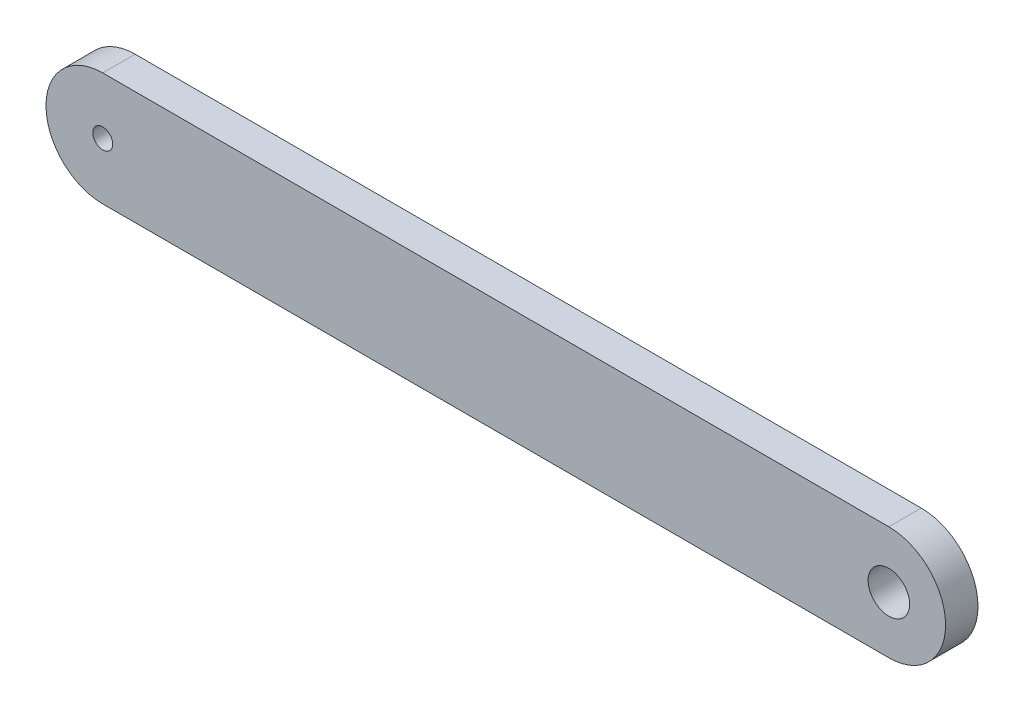
ISO-10303-21;
HEADER;
FILE_DESCRIPTION(('STEP AP214'),'2;1');
FILE_NAME('part.step','',(''),(''),'','','');
FILE_SCHEMA(('AUTOMOTIVE_DESIGN { 1 0 10303 214 1 1 1 1 }'));
ENDSEC;
DATA;
#1=APPLICATION_CONTEXT('core data for automotive mechanical design processes');
#2=APPLICATION_PROTOCOL_DEFINITION('international standard','automotive_design',2000,#1);
#3=PRODUCT_CONTEXT('',#1,'mechanical');
#4=PRODUCT('Part','Part','',(#3));
#5=PRODUCT_RELATED_PRODUCT_CATEGORY('part','',(#4));
#6=PRODUCT_DEFINITION_FORMATION('','',#4);
#7=PRODUCT_DEFINITION_CONTEXT('part definition',#1,'design');
#8=PRODUCT_DEFINITION('design','',#6,#7);
#9=PRODUCT_DEFINITION_SHAPE('','',#8);
#10=(LENGTH_UNIT() NAMED_UNIT(*) SI_UNIT(.MILLI.,.METRE.));
#11=(NAMED_UNIT(*) PLANE_ANGLE_UNIT() SI_UNIT($,.RADIAN.));
#12=(NAMED_UNIT(*) SI_UNIT($,.STERADIAN.) SOLID_ANGLE_UNIT());
#13=UNCERTAINTY_MEASURE_WITH_UNIT(LENGTH_MEASURE(1.E-05),#10,'distance_accuracy_value','');
#14=(GEOMETRIC_REPRESENTATION_CONTEXT(3) GLOBAL_UNCERTAINTY_ASSIGNED_CONTEXT((#13)) GLOBAL_UNIT_ASSIGNED_CONTEXT((#10,
#11,#12)) REPRESENTATION_CONTEXT('',''));
#15=CARTESIAN_POINT('',(0.,0.,0.));
#16=DIRECTION('',(0.,0.,1.));
#17=DIRECTION('',(1.,0.,0.));
#18=AXIS2_PLACEMENT_3D('',#15,#16,#17);
#19=CARTESIAN_POINT('',(0.,0.,5.08));
#20=DIRECTION('',(0.,0.,-1.));
#21=DIRECTION('',(-1.,0.,0.));
#22=AXIS2_PLACEMENT_3D('',#19,#20,#21);
#23=CYLINDRICAL_SURFACE('',#22,8.89);
#24=CARTESIAN_POINT('',(0.,0.,0.));
#25=DIRECTION('',(0.,0.,1.));
#26=DIRECTION('',(1.,0.,0.));
#27=AXIS2_PLACEMENT_3D('',#24,#25,#26);
#28=CIRCLE('',#27,8.89);
#29=CARTESIAN_POINT('',(0.,8.89,0.));
#30=VERTEX_POINT('',#29);
#31=CARTESIAN_POINT('',(-8.0394758274783,3.79459199643284,0.));
#32=VERTEX_POINT('',#31);
#33=EDGE_CURVE('E266',#30,#32,#28,.T.);
#34=ORIENTED_EDGE('',*,*,#33,.T.);
#35=DIRECTION('',(0.,0.,-1.));
#36=VECTOR('',#35,1.);
#37=CARTESIAN_POINT('',(-8.03947582747829,3.79459199643284,5.08));
#38=LINE('',#37,#36);
#39=CARTESIAN_POINT('',(-8.03947582747829,3.79459199643284,2.54));
#40=VERTEX_POINT('',#39);
#41=EDGE_CURVE('E255',#32,#40,#38,.F.);
#42=ORIENTED_EDGE('',*,*,#41,.T.);
#43=CARTESIAN_POINT('',(0.,0.,2.54));
#44=DIRECTION('',(0.,0.,1.));
#45=DIRECTION('',(1.,0.,0.));
#46=AXIS2_PLACEMENT_3D('',#43,#44,#45);
#47=CIRCLE('',#46,8.89);
#48=CARTESIAN_POINT('',(-8.0394758274783,-3.79459199643284,2.54));
#49=VERTEX_POINT('',#48);
#50=EDGE_CURVE('E11',#40,#49,#47,.T.);
#51=ORIENTED_EDGE('',*,*,#50,.T.);
#52=DIRECTION('',(0.,0.,-1.));
#53=VECTOR('',#52,1.);
#54=CARTESIAN_POINT('',(-8.0394758274783,-3.79459199643284,5.08));
#55=LINE('',#54,#53);
#56=CARTESIAN_POINT('',(-8.0394758274783,-3.79459199643284,0.));
#57=VERTEX_POINT('',#56);
#58=EDGE_CURVE('E237',#49,#57,#55,.T.);
#59=ORIENTED_EDGE('',*,*,#58,.T.);
#60=CARTESIAN_POINT('',(0.,-8.89,0.));
#61=VERTEX_POINT('',#60);
#62=EDGE_CURVE('E258',#57,#61,#28,.T.);
#63=ORIENTED_EDGE('',*,*,#62,.T.);
#64=DIRECTION('',(0.,0.,-1.));
#65=VECTOR('',#64,1.);
#66=CARTESIAN_POINT('',(0.,-8.89,5.08));
#67=LINE('',#66,#65);
#68=CARTESIAN_POINT('',(0.,-8.89,5.08));
#69=VERTEX_POINT('',#68);
#70=EDGE_CURVE('E280',#69,#61,#67,.T.);
#71=ORIENTED_EDGE('',*,*,#70,.F.);
#72=CARTESIAN_POINT('',(0.,0.,5.08));
#73=DIRECTION('',(0.,0.,1.));
#74=DIRECTION('',(1.,0.,0.));
#75=AXIS2_PLACEMENT_3D('',#72,#73,#74);
#76=CIRCLE('',#75,8.89);
#77=CARTESIAN_POINT('',(0.,8.89,5.08));
#78=VERTEX_POINT('',#77);
#79=EDGE_CURVE('E259',#78,#69,#76,.T.);
#80=ORIENTED_EDGE('',*,*,#79,.F.);
#81=DIRECTION('',(0.,0.,-1.));
#82=VECTOR('',#81,1.);
#83=CARTESIAN_POINT('',(0.,8.89,5.08));
#84=LINE('',#83,#82);
#85=EDGE_CURVE('E265',#78,#30,#84,.T.);
#86=ORIENTED_EDGE('',*,*,#85,.T.);
#87=EDGE_LOOP('',(#34,#42,#51,#59,#63,#71,#80,#86));
#88=FACE_BOUND('',#87,.T.);
#89=ADVANCED_FACE('F37',(#88),#23,.T.);
#90=CARTESIAN_POINT('',(123.19,-8.89000000000003,5.08));
#91=DIRECTION('',(0.,1.,0.));
#92=DIRECTION('',(-1.,0.,0.));
#93=AXIS2_PLACEMENT_3D('',#90,#91,#92);
#94=PLANE('',#93);
#95=DIRECTION('',(1.,0.,0.));
#96=VECTOR('',#95,1.);
#97=CARTESIAN_POINT('',(123.19,-8.89000000000003,0.));
#98=LINE('',#97,#96);
#99=CARTESIAN_POINT('',(123.19,-8.89000000000003,0.));
#100=VERTEX_POINT('',#99);
#101=EDGE_CURVE('E269',#61,#100,#98,.T.);
#102=ORIENTED_EDGE('',*,*,#101,.T.);
#103=DIRECTION('',(0.,0.,-1.));
#104=VECTOR('',#103,1.);
#105=CARTESIAN_POINT('',(123.19,-8.89000000000003,5.08));
#106=LINE('',#105,#104);
#107=CARTESIAN_POINT('',(123.19,-8.89000000000003,5.08));
#108=VERTEX_POINT('',#107);
#109=EDGE_CURVE('E277',#108,#100,#106,.T.);
#110=ORIENTED_EDGE('',*,*,#109,.F.);
#111=DIRECTION('',(1.,0.,0.));
#112=VECTOR('',#111,1.);
#113=CARTESIAN_POINT('',(123.19,-8.89000000000003,5.08));
#114=LINE('',#113,#112);
#115=EDGE_CURVE('E90',#69,#108,#114,.T.);
#116=ORIENTED_EDGE('',*,*,#115,.F.);
#117=ORIENTED_EDGE('',*,*,#70,.T.);
#118=EDGE_LOOP('',(#102,#110,#116,#117));
#119=FACE_BOUND('',#118,.T.);
#120=ADVANCED_FACE('F298',(#119),#94,.F.);
#121=CARTESIAN_POINT('',(123.19,0.,5.08));
#122=DIRECTION('',(0.,0.,-1.));
#123=DIRECTION('',(-1.,0.,0.));
#124=AXIS2_PLACEMENT_3D('',#121,#122,#123);
#125=CYLINDRICAL_SURFACE('',#124,8.89000000000003);
#126=CARTESIAN_POINT('',(123.19,0.,0.));
#127=DIRECTION('',(0.,0.,1.));
#128=DIRECTION('',(-1.,0.,0.));
#129=AXIS2_PLACEMENT_3D('',#126,#127,#128);
#130=CIRCLE('',#129,8.89000000000003);
#131=CARTESIAN_POINT('',(123.19,8.89000000000003,0.));
#132=VERTEX_POINT('',#131);
#133=EDGE_CURVE('E271',#100,#132,#130,.T.);
#134=ORIENTED_EDGE('',*,*,#133,.T.);
#135=DIRECTION('',(0.,0.,-1.));
#136=VECTOR('',#135,1.);
#137=CARTESIAN_POINT('',(123.19,8.89000000000003,5.08));
#138=LINE('',#137,#136);
#139=CARTESIAN_POINT('',(123.19,8.89000000000003,5.08));
#140=VERTEX_POINT('',#139);
#141=EDGE_CURVE('E275',#140,#132,#138,.T.);
#142=ORIENTED_EDGE('',*,*,#141,.F.);
#143=CARTESIAN_POINT('',(123.19,0.,5.08));
#144=DIRECTION('',(0.,0.,1.));
#145=DIRECTION('',(-1.,0.,0.));
#146=AXIS2_PLACEMENT_3D('',#143,#144,#145);
#147=CIRCLE('',#146,8.89000000000003);
#148=EDGE_CURVE('E262',#108,#140,#147,.T.);
#149=ORIENTED_EDGE('',*,*,#148,.F.);
#150=ORIENTED_EDGE('',*,*,#109,.T.);
#151=EDGE_LOOP('',(#134,#142,#149,#150));
#152=FACE_BOUND('',#151,.T.);
#153=ADVANCED_FACE('F297',(#152),#125,.T.);
#154=CARTESIAN_POINT('',(0.,8.89,5.08));
#155=DIRECTION('',(0.,-1.,0.));
#156=DIRECTION('',(1.,0.,0.));
#157=AXIS2_PLACEMENT_3D('',#154,#155,#156);
#158=PLANE('',#157);
#159=DIRECTION('',(-1.,0.,0.));
#160=VECTOR('',#159,1.);
#161=CARTESIAN_POINT('',(0.,8.89,0.));
#162=LINE('',#161,#160);
#163=EDGE_CURVE('E82',#132,#30,#162,.T.);
#164=ORIENTED_EDGE('',*,*,#163,.T.);
#165=ORIENTED_EDGE('',*,*,#85,.F.);
#166=DIRECTION('',(-1.,0.,0.));
#167=VECTOR('',#166,1.);
#168=CARTESIAN_POINT('',(0.,8.89,5.08));
#169=LINE('',#168,#167);
#170=EDGE_CURVE('E61',#140,#78,#169,.T.);
#171=ORIENTED_EDGE('',*,*,#170,.F.);
#172=ORIENTED_EDGE('',*,*,#141,.T.);
#173=EDGE_LOOP('',(#164,#165,#171,#172));
#174=FACE_BOUND('',#173,.T.);
#175=ADVANCED_FACE('F290',(#174),#158,.F.);
#176=CARTESIAN_POINT('',(0.,0.,5.08));
#177=DIRECTION('',(0.,0.,1.));
#178=DIRECTION('',(1.,0.,0.));
#179=AXIS2_PLACEMENT_3D('',#176,#177,#178);
#180=PLANE('',#179);
#181=CARTESIAN_POINT('',(123.19,0.,5.08));
#182=DIRECTION('',(0.,0.,-1.));
#183=DIRECTION('',(-1.,0.,0.));
#184=AXIS2_PLACEMENT_3D('',#181,#182,#183);
#185=CIRCLE('',#184,3.25120000000001);
#186=CARTESIAN_POINT('',(119.9388,0.,5.08));
#187=VERTEX_POINT('',#186);
#188=EDGE_CURVE('E540',#187,#187,#185,.T.);
#189=ORIENTED_EDGE('',*,*,#188,.T.);
#190=EDGE_LOOP('',(#189));
#191=FACE_BOUND('',#190,.T.);
#192=CARTESIAN_POINT('',(0.,0.,5.08));
#193=DIRECTION('',(0.,0.,1.));
#194=DIRECTION('',(1.,0.,0.));
#195=AXIS2_PLACEMENT_3D('',#192,#193,#194);
#196=CIRCLE('',#195,1.5621);
#197=CARTESIAN_POINT('',(1.5621,0.,5.08));
#198=VERTEX_POINT('',#197);
#199=EDGE_CURVE('E186',#198,#198,#196,.T.);
#200=ORIENTED_EDGE('',*,*,#199,.F.);
#201=EDGE_LOOP('',(#200));
#202=FACE_BOUND('',#201,.T.);
#203=ORIENTED_EDGE('',*,*,#79,.T.);
#204=ORIENTED_EDGE('',*,*,#115,.T.);
#205=ORIENTED_EDGE('',*,*,#148,.T.);
#206=ORIENTED_EDGE('',*,*,#170,.T.);
#207=EDGE_LOOP('',(#203,#204,#205,#206));
#208=FACE_BOUND('',#207,.T.);
#209=ADVANCED_FACE('F351',(#191,#202,#208),#180,.T.);
#210=CARTESIAN_POINT('',(0.,0.,0.));
#211=DIRECTION('',(0.,0.,1.));
#212=DIRECTION('',(1.,0.,0.));
#213=AXIS2_PLACEMENT_3D('',#210,#211,#212);
#214=PLANE('',#213);
#215=CARTESIAN_POINT('',(123.19,0.,0.));
#216=DIRECTION('',(0.,0.,-1.));
#217=DIRECTION('',(-1.,0.,0.));
#218=AXIS2_PLACEMENT_3D('',#215,#216,#217);
#219=CIRCLE('',#218,3.25120000000001);
#220=CARTESIAN_POINT('',(119.9388,0.,0.));
#221=VERTEX_POINT('',#220);
#222=EDGE_CURVE('E543',#221,#221,#219,.T.);
#223=ORIENTED_EDGE('',*,*,#222,.F.);
#224=EDGE_LOOP('',(#223));
#225=FACE_BOUND('',#224,.T.);
#226=CARTESIAN_POINT('',(-5.58736496391635,6.35,0.));
#227=DIRECTION('',(0.,0.,1.));
#228=DIRECTION('',(1.,0.,0.));
#229=AXIS2_PLACEMENT_3D('',#226,#227,#228);
#230=CIRCLE('',#229,2.286);
#231=CARTESIAN_POINT('',(-5.34917440532224,4.07644303836552,0.));
#232=VERTEX_POINT('',#231);
#233=CARTESIAN_POINT('',(-4.07726632502004,4.63378378378379,0.));
#234=VERTEX_POINT('',#233);
#235=EDGE_CURVE('E52',#232,#234,#230,.T.);
#236=ORIENTED_EDGE('',*,*,#235,.F.);
#237=DIRECTION('',(-0.994556851108697,-0.104195344966817,0.));
#238=VECTOR('',#237,1.);
#239=CARTESIAN_POINT('',(-0.480508651610108,4.58651172591279,0.));
#240=LINE('',#239,#238);
#241=EDGE_CURVE('E45',#232,#32,#240,.T.);
#242=ORIENTED_EDGE('',*,*,#241,.T.);
#243=ORIENTED_EDGE('',*,*,#33,.F.);
#244=ORIENTED_EDGE('',*,*,#163,.F.);
#245=ORIENTED_EDGE('',*,*,#133,.F.);
#246=ORIENTED_EDGE('',*,*,#101,.F.);
#247=ORIENTED_EDGE('',*,*,#62,.F.);
#248=DIRECTION('',(-0.994556851108697,0.104195344966817,0.));
#249=VECTOR('',#248,1.);
#250=CARTESIAN_POINT('',(-5.34917440532224,-4.07644303836551,0.));
#251=LINE('',#250,#249);
#252=CARTESIAN_POINT('',(-5.34917440532224,-4.07644303836551,0.));
#253=VERTEX_POINT('',#252);
#254=EDGE_CURVE('E181',#253,#57,#251,.T.);
#255=ORIENTED_EDGE('',*,*,#254,.F.);
#256=CARTESIAN_POINT('',(-5.58736496391639,-6.3500000000001,0.));
#257=DIRECTION('',(0.,0.,1.));
#258=DIRECTION('',(1.,0.,0.));
#259=AXIS2_PLACEMENT_3D('',#256,#257,#258);
#260=CIRCLE('',#259,2.2860000000001);
#261=CARTESIAN_POINT('',(-4.07726632502003,-4.63378378378379,0.));
#262=VERTEX_POINT('',#261);
#263=EDGE_CURVE('E183',#262,#253,#260,.T.);
#264=ORIENTED_EDGE('',*,*,#263,.F.);
#265=CARTESIAN_POINT('',(0.,1.35308431126191E-13,0.));
#266=DIRECTION('',(0.,0.,-1.));
#267=DIRECTION('',(-1.,0.,0.));
#268=AXIS2_PLACEMENT_3D('',#265,#266,#267);
#269=CIRCLE('',#268,6.1722000000001);
#270=CARTESIAN_POINT('',(4.07726632502005,-4.63378378378379,0.));
#271=VERTEX_POINT('',#270);
#272=EDGE_CURVE('E230',#271,#262,#269,.T.);
#273=ORIENTED_EDGE('',*,*,#272,.F.);
#274=CARTESIAN_POINT('',(5.58736496391641,-6.35000000000011,0.));
#275=DIRECTION('',(0.,0.,1.));
#276=DIRECTION('',(1.,0.,0.));
#277=AXIS2_PLACEMENT_3D('',#274,#275,#276);
#278=CIRCLE('',#277,2.28600000000011);
#279=CARTESIAN_POINT('',(5.34917440532226,-4.07644303836552,0.));
#280=VERTEX_POINT('',#279);
#281=EDGE_CURVE('E227',#280,#271,#278,.T.);
#282=ORIENTED_EDGE('',*,*,#281,.F.);
#283=DIRECTION('',(-0.994556851108697,-0.104195344966817,0.));
#284=VECTOR('',#283,1.);
#285=CARTESIAN_POINT('',(16.6336571104214,-2.89421744018161,0.));
#286=LINE('',#285,#284);
#287=CARTESIAN_POINT('',(16.6336571104214,-2.89421744018158,0.));
#288=VERTEX_POINT('',#287);
#289=EDGE_CURVE('E224',#288,#280,#286,.T.);
#290=ORIENTED_EDGE('',*,*,#289,.F.);
#291=CARTESIAN_POINT('',(16.3304426845668,0.,0.));
#292=DIRECTION('',(0.,0.,-1.));
#293=DIRECTION('',(-1.,0.,0.));
#294=AXIS2_PLACEMENT_3D('',#291,#292,#293);
#295=CIRCLE('',#294,2.9100573154317);
#296=CARTESIAN_POINT('',(16.6372672129506,2.89383694908325,0.));
#297=VERTEX_POINT('',#296);
#298=EDGE_CURVE('E221',#297,#288,#295,.T.);
#299=ORIENTED_EDGE('',*,*,#298,.F.);
#300=DIRECTION('',(0.994426100729215,-0.105435905594291,0.));
#301=VECTOR('',#300,1.);
#302=CARTESIAN_POINT('',(5.60044007365486,4.06403739280247,0.));
#303=LINE('',#302,#301);
#304=CARTESIAN_POINT('',(5.60044007365486,4.06403739280247,0.));
#305=VERTEX_POINT('',#304);
#306=EDGE_CURVE('E218',#305,#297,#303,.T.);
#307=ORIENTED_EDGE('',*,*,#306,.F.);
#308=CARTESIAN_POINT('',(5.58736496391637,6.35,0.));
#309=DIRECTION('',(0.,0.,1.));
#310=DIRECTION('',(-1.,0.,0.));
#311=AXIS2_PLACEMENT_3D('',#308,#309,#310);
#312=CIRCLE('',#311,2.286);
#313=CARTESIAN_POINT('',(4.07726632502005,4.63378378378378,0.));
#314=VERTEX_POINT('',#313);
#315=EDGE_CURVE('E215',#314,#305,#312,.T.);
#316=ORIENTED_EDGE('',*,*,#315,.F.);
#317=CARTESIAN_POINT('',(0.,0.,0.));
#318=DIRECTION('',(0.,0.,-1.));
#319=DIRECTION('',(-1.,0.,0.));
#320=AXIS2_PLACEMENT_3D('',#317,#318,#319);
#321=CIRCLE('',#320,6.1722);
#322=EDGE_CURVE('E213',#234,#314,#321,.T.);
#323=ORIENTED_EDGE('',*,*,#322,.F.);
#324=EDGE_LOOP('',(#236,#242,#243,#244,#245,#246,#247,#255,#264,#273,#282,#290,#299,#307,#316,#323));
#325=FACE_BOUND('',#324,.T.);
#326=ADVANCED_FACE('F285',(#225,#325),#214,.F.);
#327=CARTESIAN_POINT('',(-5.58736496391635,6.35,2.54));
#328=DIRECTION('',(0.,0.,1.));
#329=DIRECTION('',(1.,0.,0.));
#330=AXIS2_PLACEMENT_3D('',#327,#328,#329);
#331=PLANE('',#330);
#332=CARTESIAN_POINT('',(0.,0.,2.54));
#333=DIRECTION('',(0.,0.,1.));
#334=DIRECTION('',(1.,0.,0.));
#335=AXIS2_PLACEMENT_3D('',#332,#333,#334);
#336=CIRCLE('',#335,1.5621);
#337=CARTESIAN_POINT('',(1.5621,0.,2.54));
#338=VERTEX_POINT('',#337);
#339=EDGE_CURVE('E40',#338,#338,#336,.T.);
#340=ORIENTED_EDGE('',*,*,#339,.T.);
#341=EDGE_LOOP('',(#340));
#342=FACE_BOUND('',#341,.T.);
#343=DIRECTION('',(0.994556851108697,0.104195344966817,0.));
#344=VECTOR('',#343,1.);
#345=CARTESIAN_POINT('',(-16.6336571104214,2.89421744018161,2.54));
#346=LINE('',#345,#344);
#347=CARTESIAN_POINT('',(-5.34917440532224,4.07644303836552,2.54));
#348=VERTEX_POINT('',#347);
#349=EDGE_CURVE('E168',#40,#348,#346,.T.);
#350=ORIENTED_EDGE('',*,*,#349,.T.);
#351=CARTESIAN_POINT('',(-5.58736496391635,6.35,2.54));
#352=DIRECTION('',(0.,0.,1.));
#353=DIRECTION('',(1.,0.,0.));
#354=AXIS2_PLACEMENT_3D('',#351,#352,#353);
#355=CIRCLE('',#354,2.286);
#356=CARTESIAN_POINT('',(-4.07726632502004,4.63378378378379,2.54));
#357=VERTEX_POINT('',#356);
#358=EDGE_CURVE('E163',#348,#357,#355,.T.);
#359=ORIENTED_EDGE('',*,*,#358,.T.);
#360=CARTESIAN_POINT('',(0.,0.,2.54));
#361=DIRECTION('',(0.,0.,-1.));
#362=DIRECTION('',(-1.,0.,0.));
#363=AXIS2_PLACEMENT_3D('',#360,#361,#362);
#364=CIRCLE('',#363,6.1722);
#365=CARTESIAN_POINT('',(4.07726632502005,4.63378378378378,2.54));
#366=VERTEX_POINT('',#365);
#367=EDGE_CURVE('E171',#357,#366,#364,.T.);
#368=ORIENTED_EDGE('',*,*,#367,.T.);
#369=CARTESIAN_POINT('',(5.58736496391637,6.35,2.54));
#370=DIRECTION('',(0.,0.,1.));
#371=DIRECTION('',(-1.,0.,0.));
#372=AXIS2_PLACEMENT_3D('',#369,#370,#371);
#373=CIRCLE('',#372,2.286);
#374=CARTESIAN_POINT('',(5.60044007365486,4.06403739280247,2.54));
#375=VERTEX_POINT('',#374);
#376=EDGE_CURVE('E176',#366,#375,#373,.T.);
#377=ORIENTED_EDGE('',*,*,#376,.T.);
#378=DIRECTION('',(0.994426100729215,-0.105435905594291,0.));
#379=VECTOR('',#378,1.);
#380=CARTESIAN_POINT('',(5.60044007365486,4.06403739280247,2.54));
#381=LINE('',#380,#379);
#382=CARTESIAN_POINT('',(16.6372672129506,2.89383694908325,2.54));
#383=VERTEX_POINT('',#382);
#384=EDGE_CURVE('E190',#375,#383,#381,.T.);
#385=ORIENTED_EDGE('',*,*,#384,.T.);
#386=CARTESIAN_POINT('',(16.3304426845668,0.,2.54));
#387=DIRECTION('',(0.,0.,-1.));
#388=DIRECTION('',(-1.,0.,0.));
#389=AXIS2_PLACEMENT_3D('',#386,#387,#388);
#390=CIRCLE('',#389,2.9100573154317);
#391=CARTESIAN_POINT('',(16.6336571104214,-2.89421744018158,2.54));
#392=VERTEX_POINT('',#391);
#393=EDGE_CURVE('E193',#383,#392,#390,.T.);
#394=ORIENTED_EDGE('',*,*,#393,.T.);
#395=DIRECTION('',(-0.994556851108697,-0.104195344966817,0.));
#396=VECTOR('',#395,1.);
#397=CARTESIAN_POINT('',(16.6336571104214,-2.89421744018161,2.54));
#398=LINE('',#397,#396);
#399=CARTESIAN_POINT('',(5.34917440532226,-4.07644303836552,2.54));
#400=VERTEX_POINT('',#399);
#401=EDGE_CURVE('E196',#392,#400,#398,.T.);
#402=ORIENTED_EDGE('',*,*,#401,.T.);
#403=CARTESIAN_POINT('',(5.58736496391641,-6.35000000000011,2.54));
#404=DIRECTION('',(0.,0.,1.));
#405=DIRECTION('',(1.,0.,0.));
#406=AXIS2_PLACEMENT_3D('',#403,#404,#405);
#407=CIRCLE('',#406,2.28600000000011);
#408=CARTESIAN_POINT('',(4.07726632502005,-4.63378378378379,2.54));
#409=VERTEX_POINT('',#408);
#410=EDGE_CURVE('E199',#400,#409,#407,.T.);
#411=ORIENTED_EDGE('',*,*,#410,.T.);
#412=CARTESIAN_POINT('',(0.,1.35308431126191E-13,2.54));
#413=DIRECTION('',(0.,0.,-1.));
#414=DIRECTION('',(-1.,0.,0.));
#415=AXIS2_PLACEMENT_3D('',#412,#413,#414);
#416=CIRCLE('',#415,6.1722000000001);
#417=CARTESIAN_POINT('',(-4.07726632502003,-4.63378378378379,2.54));
#418=VERTEX_POINT('',#417);
#419=EDGE_CURVE('E202',#409,#418,#416,.T.);
#420=ORIENTED_EDGE('',*,*,#419,.T.);
#421=CARTESIAN_POINT('',(-5.58736496391639,-6.3500000000001,2.54));
#422=DIRECTION('',(0.,0.,1.));
#423=DIRECTION('',(1.,0.,0.));
#424=AXIS2_PLACEMENT_3D('',#421,#422,#423);
#425=CIRCLE('',#424,2.2860000000001);
#426=CARTESIAN_POINT('',(-5.34917440532224,-4.07644303836551,2.54));
#427=VERTEX_POINT('',#426);
#428=EDGE_CURVE('E205',#418,#427,#425,.T.);
#429=ORIENTED_EDGE('',*,*,#428,.T.);
#430=DIRECTION('',(-0.994556851108697,0.104195344966817,0.));
#431=VECTOR('',#430,1.);
#432=CARTESIAN_POINT('',(-5.34917440532224,-4.07644303836551,2.54));
#433=LINE('',#432,#431);
#434=EDGE_CURVE('E208',#427,#49,#433,.T.);
#435=ORIENTED_EDGE('',*,*,#434,.T.);
#436=ORIENTED_EDGE('',*,*,#50,.F.);
#437=EDGE_LOOP('',(#350,#359,#368,#377,#385,#394,#402,#411,#420,#429,#435,#436));
#438=FACE_BOUND('',#437,.T.);
#439=ADVANCED_FACE('F178',(#342,#438),#331,.F.);
#440=CARTESIAN_POINT('',(-16.6336571104214,2.89421744018161,2.54));
#441=DIRECTION('',(-0.104195344966817,0.994556851108697,0.));
#442=DIRECTION('',(-0.994556851108697,-0.104195344966817,0.));
#443=AXIS2_PLACEMENT_3D('',#440,#441,#442);
#444=PLANE('',#443);
#445=ORIENTED_EDGE('',*,*,#241,.F.);
#446=DIRECTION('',(0.,0.,-1.));
#447=VECTOR('',#446,1.);
#448=CARTESIAN_POINT('',(-5.34917440532224,4.07644303836552,2.54));
#449=LINE('',#448,#447);
#450=EDGE_CURVE('E235',#348,#232,#449,.T.);
#451=ORIENTED_EDGE('',*,*,#450,.F.);
#452=ORIENTED_EDGE('',*,*,#349,.F.);
#453=ORIENTED_EDGE('',*,*,#41,.F.);
#454=EDGE_LOOP('',(#445,#451,#452,#453));
#455=FACE_BOUND('',#454,.T.);
#456=ADVANCED_FACE('F330',(#455),#444,.F.);
#457=CARTESIAN_POINT('',(-5.34917440532224,-4.07644303836551,2.54));
#458=DIRECTION('',(-0.104195344966817,-0.994556851108697,0.));
#459=DIRECTION('',(0.994556851108697,-0.104195344966817,0.));
#460=AXIS2_PLACEMENT_3D('',#457,#458,#459);
#461=PLANE('',#460);
#462=ORIENTED_EDGE('',*,*,#434,.F.);
#463=DIRECTION('',(0.,0.,-1.));
#464=VECTOR('',#463,1.);
#465=CARTESIAN_POINT('',(-5.34917440532224,-4.07644303836551,2.54));
#466=LINE('',#465,#464);
#467=EDGE_CURVE('E238',#427,#253,#466,.T.);
#468=ORIENTED_EDGE('',*,*,#467,.T.);
#469=ORIENTED_EDGE('',*,*,#254,.T.);
#470=ORIENTED_EDGE('',*,*,#58,.F.);
#471=EDGE_LOOP('',(#462,#468,#469,#470));
#472=FACE_BOUND('',#471,.T.);
#473=ADVANCED_FACE('F304',(#472),#461,.F.);
#474=CARTESIAN_POINT('',(-5.58736496391635,6.35,2.54));
#475=DIRECTION('',(0.,0.,-1.));
#476=DIRECTION('',(-1.,0.,0.));
#477=AXIS2_PLACEMENT_3D('',#474,#475,#476);
#478=CYLINDRICAL_SURFACE('',#477,2.286);
#479=ORIENTED_EDGE('',*,*,#235,.T.);
#480=DIRECTION('',(0.,0.,-1.));
#481=VECTOR('',#480,1.);
#482=CARTESIAN_POINT('',(-4.07726632502004,4.63378378378379,2.54));
#483=LINE('',#482,#481);
#484=EDGE_CURVE('E159',#357,#234,#483,.T.);
#485=ORIENTED_EDGE('',*,*,#484,.F.);
#486=ORIENTED_EDGE('',*,*,#358,.F.);
#487=ORIENTED_EDGE('',*,*,#450,.T.);
#488=EDGE_LOOP('',(#479,#485,#486,#487));
#489=FACE_BOUND('',#488,.T.);
#490=ADVANCED_FACE('F161',(#489),#478,.T.);
#491=CARTESIAN_POINT('',(-5.58736496391639,-6.3500000000001,2.54));
#492=DIRECTION('',(0.,0.,-1.));
#493=DIRECTION('',(-1.,0.,0.));
#494=AXIS2_PLACEMENT_3D('',#491,#492,#493);
#495=CYLINDRICAL_SURFACE('',#494,2.2860000000001);
#496=ORIENTED_EDGE('',*,*,#263,.T.);
#497=ORIENTED_EDGE('',*,*,#467,.F.);
#498=ORIENTED_EDGE('',*,*,#428,.F.);
#499=DIRECTION('',(0.,0.,-1.));
#500=VECTOR('',#499,1.);
#501=CARTESIAN_POINT('',(-4.07726632502003,-4.63378378378379,2.54));
#502=LINE('',#501,#500);
#503=EDGE_CURVE('E240',#418,#262,#502,.T.);
#504=ORIENTED_EDGE('',*,*,#503,.T.);
#505=EDGE_LOOP('',(#496,#497,#498,#504));
#506=FACE_BOUND('',#505,.T.);
#507=ADVANCED_FACE('F307',(#506),#495,.T.);
#508=CARTESIAN_POINT('',(0.,1.35308431126191E-13,2.54));
#509=DIRECTION('',(0.,0.,-1.));
#510=DIRECTION('',(-1.,0.,0.));
#511=AXIS2_PLACEMENT_3D('',#508,#509,#510);
#512=CYLINDRICAL_SURFACE('',#511,6.1722000000001);
#513=ORIENTED_EDGE('',*,*,#272,.T.);
#514=ORIENTED_EDGE('',*,*,#503,.F.);
#515=ORIENTED_EDGE('',*,*,#419,.F.);
#516=DIRECTION('',(0.,0.,-1.));
#517=VECTOR('',#516,1.);
#518=CARTESIAN_POINT('',(4.07726632502005,-4.63378378378379,2.54));
#519=LINE('',#518,#517);
#520=EDGE_CURVE('E242',#409,#271,#519,.T.);
#521=ORIENTED_EDGE('',*,*,#520,.T.);
#522=EDGE_LOOP('',(#513,#514,#515,#521));
#523=FACE_BOUND('',#522,.T.);
#524=ADVANCED_FACE('F310',(#523),#512,.F.);
#525=CARTESIAN_POINT('',(5.58736496391641,-6.35000000000011,2.54));
#526=DIRECTION('',(0.,0.,-1.));
#527=DIRECTION('',(-1.,0.,0.));
#528=AXIS2_PLACEMENT_3D('',#525,#526,#527);
#529=CYLINDRICAL_SURFACE('',#528,2.28600000000011);
#530=ORIENTED_EDGE('',*,*,#281,.T.);
#531=ORIENTED_EDGE('',*,*,#520,.F.);
#532=ORIENTED_EDGE('',*,*,#410,.F.);
#533=DIRECTION('',(0.,0.,-1.));
#534=VECTOR('',#533,1.);
#535=CARTESIAN_POINT('',(5.34917440532226,-4.07644303836552,2.54));
#536=LINE('',#535,#534);
#537=EDGE_CURVE('E244',#400,#280,#536,.T.);
#538=ORIENTED_EDGE('',*,*,#537,.T.);
#539=EDGE_LOOP('',(#530,#531,#532,#538));
#540=FACE_BOUND('',#539,.T.);
#541=ADVANCED_FACE('F315',(#540),#529,.T.);
#542=CARTESIAN_POINT('',(16.6336571104214,-2.89421744018161,2.54));
#543=DIRECTION('',(0.104195344966817,-0.994556851108697,0.));
#544=DIRECTION('',(0.994556851108697,0.104195344966817,0.));
#545=AXIS2_PLACEMENT_3D('',#542,#543,#544);
#546=PLANE('',#545);
#547=ORIENTED_EDGE('',*,*,#289,.T.);
#548=ORIENTED_EDGE('',*,*,#537,.F.);
#549=ORIENTED_EDGE('',*,*,#401,.F.);
#550=DIRECTION('',(0.,0.,-1.));
#551=VECTOR('',#550,1.);
#552=CARTESIAN_POINT('',(16.6336571104214,-2.89421744018158,2.54));
#553=LINE('',#552,#551);
#554=EDGE_CURVE('E246',#392,#288,#553,.T.);
#555=ORIENTED_EDGE('',*,*,#554,.T.);
#556=EDGE_LOOP('',(#547,#548,#549,#555));
#557=FACE_BOUND('',#556,.T.);
#558=ADVANCED_FACE('F319',(#557),#546,.F.);
#559=CARTESIAN_POINT('',(16.3304426845668,0.,2.54));
#560=DIRECTION('',(0.,0.,-1.));
#561=DIRECTION('',(-1.,0.,0.));
#562=AXIS2_PLACEMENT_3D('',#559,#560,#561);
#563=CYLINDRICAL_SURFACE('',#562,2.9100573154317);
#564=ORIENTED_EDGE('',*,*,#298,.T.);
#565=ORIENTED_EDGE('',*,*,#554,.F.);
#566=ORIENTED_EDGE('',*,*,#393,.F.);
#567=DIRECTION('',(0.,0.,-1.));
#568=VECTOR('',#567,1.);
#569=CARTESIAN_POINT('',(16.6372672129506,2.89383694908325,2.54));
#570=LINE('',#569,#568);
#571=EDGE_CURVE('E248',#383,#297,#570,.T.);
#572=ORIENTED_EDGE('',*,*,#571,.T.);
#573=EDGE_LOOP('',(#564,#565,#566,#572));
#574=FACE_BOUND('',#573,.T.);
#575=ADVANCED_FACE('F322',(#574),#563,.F.);
#576=CARTESIAN_POINT('',(5.60044007365486,4.06403739280247,2.54));
#577=DIRECTION('',(0.105435905594291,0.994426100729215,0.));
#578=DIRECTION('',(-0.994426100729216,0.105435905594291,0.));
#579=AXIS2_PLACEMENT_3D('',#576,#577,#578);
#580=PLANE('',#579);
#581=ORIENTED_EDGE('',*,*,#306,.T.);
#582=ORIENTED_EDGE('',*,*,#571,.F.);
#583=ORIENTED_EDGE('',*,*,#384,.F.);
#584=DIRECTION('',(0.,0.,-1.));
#585=VECTOR('',#584,1.);
#586=CARTESIAN_POINT('',(5.60044007365486,4.06403739280247,2.54));
#587=LINE('',#586,#585);
#588=EDGE_CURVE('E250',#375,#305,#587,.T.);
#589=ORIENTED_EDGE('',*,*,#588,.T.);
#590=EDGE_LOOP('',(#581,#582,#583,#589));
#591=FACE_BOUND('',#590,.T.);
#592=ADVANCED_FACE('F326',(#591),#580,.F.);
#593=CARTESIAN_POINT('',(5.58736496391637,6.35,2.54));
#594=DIRECTION('',(0.,0.,-1.));
#595=DIRECTION('',(-1.,0.,0.));
#596=AXIS2_PLACEMENT_3D('',#593,#594,#595);
#597=CYLINDRICAL_SURFACE('',#596,2.286);
#598=ORIENTED_EDGE('',*,*,#315,.T.);
#599=ORIENTED_EDGE('',*,*,#588,.F.);
#600=ORIENTED_EDGE('',*,*,#376,.F.);
#601=DIRECTION('',(0.,0.,-1.));
#602=VECTOR('',#601,1.);
#603=CARTESIAN_POINT('',(4.07726632502005,4.63378378378378,2.54));
#604=LINE('',#603,#602);
#605=EDGE_CURVE('E167',#366,#314,#604,.T.);
#606=ORIENTED_EDGE('',*,*,#605,.T.);
#607=EDGE_LOOP('',(#598,#599,#600,#606));
#608=FACE_BOUND('',#607,.T.);
#609=ADVANCED_FACE('F329',(#608),#597,.T.);
#610=CARTESIAN_POINT('',(0.,0.,2.54));
#611=DIRECTION('',(0.,0.,-1.));
#612=DIRECTION('',(-1.,0.,0.));
#613=AXIS2_PLACEMENT_3D('',#610,#611,#612);
#614=CYLINDRICAL_SURFACE('',#613,6.1722);
#615=ORIENTED_EDGE('',*,*,#322,.T.);
#616=ORIENTED_EDGE('',*,*,#605,.F.);
#617=ORIENTED_EDGE('',*,*,#367,.F.);
#618=ORIENTED_EDGE('',*,*,#484,.T.);
#619=EDGE_LOOP('',(#615,#616,#617,#618));
#620=FACE_BOUND('',#619,.T.);
#621=ADVANCED_FACE('F172',(#620),#614,.F.);
#622=CARTESIAN_POINT('',(0.,0.,0.));
#623=DIRECTION('',(0.,0.,1.));
#624=DIRECTION('',(1.,0.,0.));
#625=AXIS2_PLACEMENT_3D('',#622,#623,#624);
#626=CYLINDRICAL_SURFACE('',#625,1.5621);
#627=ORIENTED_EDGE('',*,*,#199,.T.);
#628=EDGE_LOOP('',(#627));
#629=FACE_BOUND('',#628,.T.);
#630=ORIENTED_EDGE('',*,*,#339,.F.);
#631=EDGE_LOOP('',(#630));
#632=FACE_BOUND('',#631,.T.);
#633=ADVANCED_FACE('F362',(#629,#632),#626,.F.);
#634=CARTESIAN_POINT('',(123.19,0.,5.08));
#635=DIRECTION('',(0.,0.,-1.));
#636=DIRECTION('',(-1.,0.,0.));
#637=AXIS2_PLACEMENT_3D('',#634,#635,#636);
#638=CYLINDRICAL_SURFACE('',#637,3.25120000000001);
#639=ORIENTED_EDGE('',*,*,#188,.F.);
#640=EDGE_LOOP('',(#639));
#641=FACE_BOUND('',#640,.T.);
#642=ORIENTED_EDGE('',*,*,#222,.T.);
#643=EDGE_LOOP('',(#642));
#644=FACE_BOUND('',#643,.T.);
#645=ADVANCED_FACE('F415',(#641,#644),#638,.F.);
#646=CLOSED_SHELL('',(#89,#120,#153,#175,#209,#326,#439,#456,#473,#490,#507,#524,#541,#558,#575,
#592,#609,#621,#633,#645));
#647=MANIFOLD_SOLID_BREP('B2',#646);
#648=ADVANCED_BREP_SHAPE_REPRESENTATION('',(#18,#647),#14);
#649=SHAPE_DEFINITION_REPRESENTATION(#9,#648);
ENDSEC;
END-ISO-10303-21;
